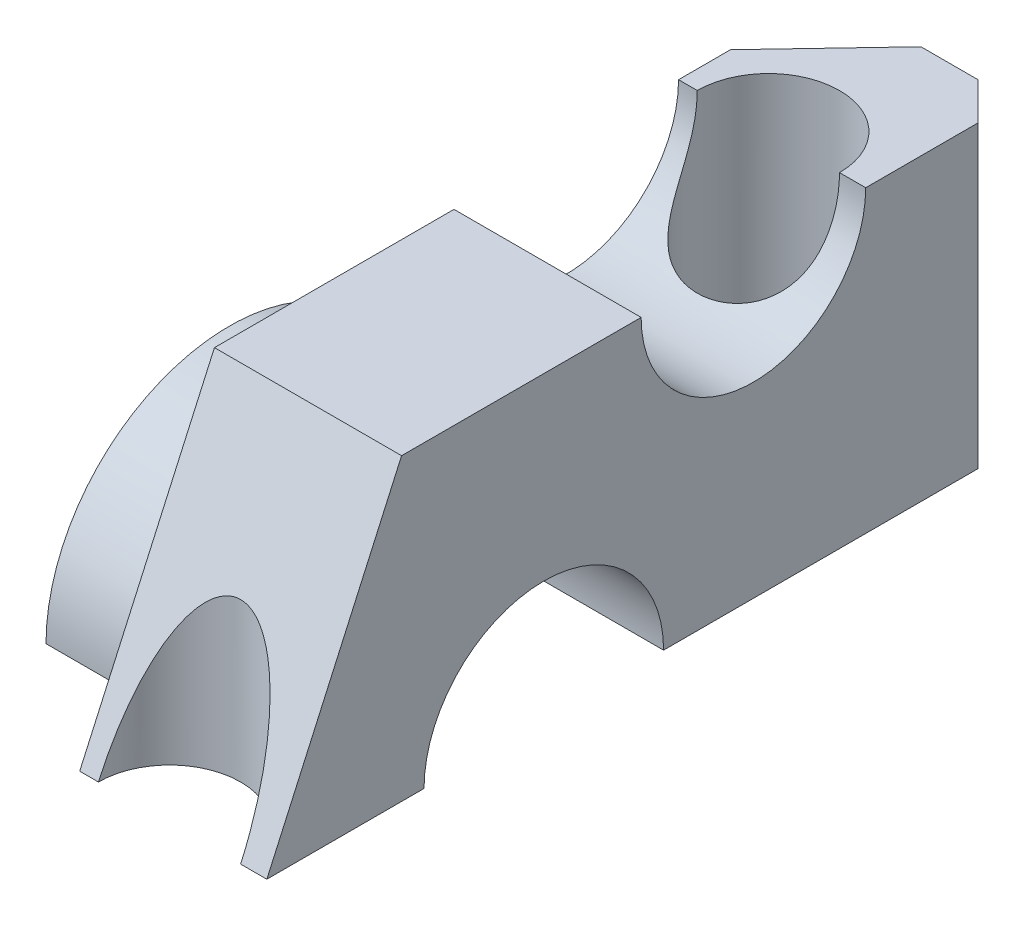
ISO-10303-21;
HEADER;
FILE_DESCRIPTION(('STEP AP214'),'2;1');
FILE_NAME('part.step','',(''),(''),'','','');
FILE_SCHEMA(('AUTOMOTIVE_DESIGN { 1 0 10303 214 1 1 1 1 }'));
ENDSEC;
DATA;
#1=APPLICATION_CONTEXT('core data for automotive mechanical design processes');
#2=APPLICATION_PROTOCOL_DEFINITION('international standard','automotive_design',2000,#1);
#3=PRODUCT_CONTEXT('',#1,'mechanical');
#4=PRODUCT('Part','Part','',(#3));
#5=PRODUCT_RELATED_PRODUCT_CATEGORY('part','',(#4));
#6=PRODUCT_DEFINITION_FORMATION('','',#4);
#7=PRODUCT_DEFINITION_CONTEXT('part definition',#1,'design');
#8=PRODUCT_DEFINITION('design','',#6,#7);
#9=PRODUCT_DEFINITION_SHAPE('','',#8);
#10=(LENGTH_UNIT() NAMED_UNIT(*) SI_UNIT(.MILLI.,.METRE.));
#11=(NAMED_UNIT(*) PLANE_ANGLE_UNIT() SI_UNIT($,.RADIAN.));
#12=(NAMED_UNIT(*) SI_UNIT($,.STERADIAN.) SOLID_ANGLE_UNIT());
#13=UNCERTAINTY_MEASURE_WITH_UNIT(LENGTH_MEASURE(1.E-05),#10,'distance_accuracy_value','');
#14=(GEOMETRIC_REPRESENTATION_CONTEXT(3) GLOBAL_UNCERTAINTY_ASSIGNED_CONTEXT((#13)) GLOBAL_UNIT_ASSIGNED_CONTEXT((#10,
#11,#12)) REPRESENTATION_CONTEXT('',''));
#15=CARTESIAN_POINT('',(0.,0.,0.));
#16=DIRECTION('',(0.,0.,1.));
#17=DIRECTION('',(1.,0.,0.));
#18=AXIS2_PLACEMENT_3D('',#15,#16,#17);
#19=CARTESIAN_POINT('',(25.,40.,0.));
#20=DIRECTION('',(0.,-1.,0.));
#21=DIRECTION('',(0.,0.,-1.));
#22=AXIS2_PLACEMENT_3D('',#19,#20,#21);
#23=PLANE('',#22);
#24=DIRECTION('',(0.,0.,1.));
#25=VECTOR('',#24,1.);
#26=CARTESIAN_POINT('',(0.,40.,0.));
#27=LINE('',#26,#25);
#28=CARTESIAN_POINT('',(0.,40.,5.00000000000003));
#29=VERTEX_POINT('',#28);
#30=CARTESIAN_POINT('',(0.,40.,20.));
#31=VERTEX_POINT('',#30);
#32=EDGE_CURVE('E153',#29,#31,#27,.T.);
#33=ORIENTED_EDGE('',*,*,#32,.F.);
#34=DIRECTION('',(-0.707106781186547,0.,-0.707106781186549));
#35=VECTOR('',#34,1.);
#36=CARTESIAN_POINT('',(0.,40.,5.00000000000003));
#37=LINE('',#36,#35);
#38=CARTESIAN_POINT('',(-5.00000000000002,40.,0.));
#39=VERTEX_POINT('',#38);
#40=EDGE_CURVE('E166',#29,#39,#37,.T.);
#41=ORIENTED_EDGE('',*,*,#40,.T.);
#42=DIRECTION('',(1.,0.,0.));
#43=VECTOR('',#42,1.);
#44=CARTESIAN_POINT('',(-25.,40.,0.));
#45=LINE('',#44,#43);
#46=CARTESIAN_POINT('',(-12.62,40.,0.));
#47=VERTEX_POINT('',#46);
#48=EDGE_CURVE('E283',#47,#39,#45,.T.);
#49=ORIENTED_EDGE('',*,*,#48,.F.);
#50=DIRECTION('',(-0.687777777777778,0.,0.725921296281533));
#51=VECTOR('',#50,1.);
#52=CARTESIAN_POINT('',(5.17569977777779,40.,-18.7826328042477));
#53=LINE('',#52,#51);
#54=CARTESIAN_POINT('',(-25.,40.,13.0665833330676));
#55=VERTEX_POINT('',#54);
#56=EDGE_CURVE('E294',#47,#55,#53,.T.);
#57=ORIENTED_EDGE('',*,*,#56,.T.);
#58=DIRECTION('',(0.,0.,1.));
#59=VECTOR('',#58,1.);
#60=CARTESIAN_POINT('',(-25.,40.,0.));
#61=LINE('',#60,#59);
#62=CARTESIAN_POINT('',(-25.,40.,20.));
#63=VERTEX_POINT('',#62);
#64=EDGE_CURVE('E281',#55,#63,#61,.T.);
#65=ORIENTED_EDGE('',*,*,#64,.T.);
#66=DIRECTION('',(1.,0.,0.));
#67=VECTOR('',#66,1.);
#68=CARTESIAN_POINT('',(-119.,40.,20.));
#69=LINE('',#68,#67);
#70=CARTESIAN_POINT('',(-22.5,40.,20.));
#71=VERTEX_POINT('',#70);
#72=EDGE_CURVE('E268',#63,#71,#69,.T.);
#73=ORIENTED_EDGE('',*,*,#72,.T.);
#74=CARTESIAN_POINT('',(-13.,40.,20.));
#75=DIRECTION('',(0.,-1.,0.));
#76=DIRECTION('',(0.,0.,-1.));
#77=AXIS2_PLACEMENT_3D('',#74,#75,#76);
#78=CIRCLE('',#77,9.5);
#79=CARTESIAN_POINT('',(-3.5,40.,20.));
#80=VERTEX_POINT('',#79);
#81=EDGE_CURVE('E267',#71,#80,#78,.T.);
#82=ORIENTED_EDGE('',*,*,#81,.T.);
#83=DIRECTION('',(-1.,0.,0.));
#84=VECTOR('',#83,1.);
#85=CARTESIAN_POINT('',(119.,40.,20.));
#86=LINE('',#85,#84);
#87=EDGE_CURVE('E168',#31,#80,#86,.T.);
#88=ORIENTED_EDGE('',*,*,#87,.F.);
#89=EDGE_LOOP('',(#33,#41,#49,#57,#65,#73,#82,#88));
#90=FACE_BOUND('',#89,.T.);
#91=ADVANCED_FACE('F35',(#90),#23,.F.);
#92=CARTESIAN_POINT('',(25.,0.,0.));
#93=DIRECTION('',(0.,1.,0.));
#94=DIRECTION('',(0.,0.,1.));
#95=AXIS2_PLACEMENT_3D('',#92,#93,#94);
#96=PLANE('',#95);
#97=DIRECTION('',(0.,0.,-1.));
#98=VECTOR('',#97,1.);
#99=CARTESIAN_POINT('',(0.,0.,0.));
#100=LINE('',#99,#98);
#101=CARTESIAN_POINT('',(0.,0.,100.));
#102=VERTEX_POINT('',#101);
#103=CARTESIAN_POINT('',(0.,0.,79.));
#104=VERTEX_POINT('',#103);
#105=EDGE_CURVE('E232',#102,#104,#100,.T.);
#106=ORIENTED_EDGE('',*,*,#105,.F.);
#107=DIRECTION('',(-1.,0.,0.));
#108=VECTOR('',#107,1.);
#109=CARTESIAN_POINT('',(25.,0.,100.));
#110=LINE('',#109,#108);
#111=CARTESIAN_POINT('',(-3.5,0.,100.));
#112=VERTEX_POINT('',#111);
#113=EDGE_CURVE('E252',#102,#112,#110,.T.);
#114=ORIENTED_EDGE('',*,*,#113,.T.);
#115=CARTESIAN_POINT('',(-13.,0.,100.));
#116=DIRECTION('',(0.,1.,0.));
#117=DIRECTION('',(0.,0.,1.));
#118=AXIS2_PLACEMENT_3D('',#115,#116,#117);
#119=CIRCLE('',#118,9.5);
#120=CARTESIAN_POINT('',(-22.5,0.,100.));
#121=VERTEX_POINT('',#120);
#122=EDGE_CURVE('E261',#112,#121,#119,.T.);
#123=ORIENTED_EDGE('',*,*,#122,.T.);
#124=CARTESIAN_POINT('',(-25.,0.,100.));
#125=VERTEX_POINT('',#124);
#126=EDGE_CURVE('E251',#121,#125,#110,.T.);
#127=ORIENTED_EDGE('',*,*,#126,.T.);
#128=DIRECTION('',(0.,0.,-1.));
#129=VECTOR('',#128,1.);
#130=CARTESIAN_POINT('',(-25.,0.,0.));
#131=LINE('',#130,#129);
#132=CARTESIAN_POINT('',(-25.,0.,87.5));
#133=VERTEX_POINT('',#132);
#134=EDGE_CURVE('E274',#125,#133,#131,.T.);
#135=ORIENTED_EDGE('',*,*,#134,.T.);
#136=DIRECTION('',(1.,0.,0.));
#137=VECTOR('',#136,1.);
#138=CARTESIAN_POINT('',(-42.,0.,87.5));
#139=LINE('',#138,#137);
#140=CARTESIAN_POINT('',(-42.,0.,87.5));
#141=VERTEX_POINT('',#140);
#142=EDGE_CURVE('E321',#141,#133,#139,.T.);
#143=ORIENTED_EDGE('',*,*,#142,.F.);
#144=DIRECTION('',(0.,0.,-1.));
#145=VECTOR('',#144,1.);
#146=CARTESIAN_POINT('',(-42.,0.,87.5));
#147=LINE('',#146,#145);
#148=CARTESIAN_POINT('',(-42.,0.,83.));
#149=VERTEX_POINT('',#148);
#150=EDGE_CURVE('E319',#141,#149,#147,.T.);
#151=ORIENTED_EDGE('',*,*,#150,.T.);
#152=DIRECTION('',(1.,0.,0.));
#153=VECTOR('',#152,1.);
#154=CARTESIAN_POINT('',(-42.,0.,83.));
#155=LINE('',#154,#153);
#156=CARTESIAN_POINT('',(-25.,0.,83.));
#157=VERTEX_POINT('',#156);
#158=EDGE_CURVE('E325',#149,#157,#155,.T.);
#159=ORIENTED_EDGE('',*,*,#158,.T.);
#160=CARTESIAN_POINT('',(-25.,0.,79.));
#161=VERTEX_POINT('',#160);
#162=EDGE_CURVE('E277',#157,#161,#131,.T.);
#163=ORIENTED_EDGE('',*,*,#162,.T.);
#164=DIRECTION('',(-1.,0.,0.));
#165=VECTOR('',#164,1.);
#166=CARTESIAN_POINT('',(119.,0.,79.));
#167=LINE('',#166,#165);
#168=EDGE_CURVE('E241',#104,#161,#167,.T.);
#169=ORIENTED_EDGE('',*,*,#168,.F.);
#170=EDGE_LOOP('',(#106,#114,#123,#127,#135,#143,#151,#159,#163,#169));
#171=FACE_BOUND('',#170,.T.);
#172=ADVANCED_FACE('F208',(#171),#96,.F.);
#173=DIRECTION('',(0.,0.,1.));
#174=VECTOR('',#173,1.);
#175=CARTESIAN_POINT('',(0.,40.,0.));
#176=LINE('',#175,#174);
#177=CARTESIAN_POINT('',(0.,40.,50.));
#178=VERTEX_POINT('',#177);
#179=CARTESIAN_POINT('',(0.,40.,82.));
#180=VERTEX_POINT('',#179);
#181=EDGE_CURVE('E226',#178,#180,#176,.T.);
#182=ORIENTED_EDGE('',*,*,#181,.F.);
#183=DIRECTION('',(-1.,0.,0.));
#184=VECTOR('',#183,1.);
#185=CARTESIAN_POINT('',(119.,40.,50.));
#186=LINE('',#185,#184);
#187=CARTESIAN_POINT('',(-25.,40.,50.));
#188=VERTEX_POINT('',#187);
#189=EDGE_CURVE('E229',#188,#178,#186,.F.);
#190=ORIENTED_EDGE('',*,*,#189,.F.);
#191=CARTESIAN_POINT('',(-25.,40.,82.));
#192=VERTEX_POINT('',#191);
#193=EDGE_CURVE('E280',#188,#192,#61,.T.);
#194=ORIENTED_EDGE('',*,*,#193,.T.);
#195=DIRECTION('',(-1.,0.,0.));
#196=VECTOR('',#195,1.);
#197=CARTESIAN_POINT('',(25.,40.,82.));
#198=LINE('',#197,#196);
#199=EDGE_CURVE('E161',#180,#192,#198,.T.);
#200=ORIENTED_EDGE('',*,*,#199,.F.);
#201=EDGE_LOOP('',(#182,#190,#194,#200));
#202=FACE_BOUND('',#201,.T.);
#203=ADVANCED_FACE('F209',(#202),#23,.F.);
#204=CARTESIAN_POINT('',(-13.,0.,20.));
#205=DIRECTION('',(0.,1.,0.));
#206=DIRECTION('',(0.,0.,1.));
#207=AXIS2_PLACEMENT_3D('',#204,#205,#206);
#208=CIRCLE('',#207,9.5);
#209=CARTESIAN_POINT('',(-13.,0.,29.5));
#210=VERTEX_POINT('',#209);
#211=EDGE_CURVE('E186',#210,#210,#208,.T.);
#212=ORIENTED_EDGE('',*,*,#211,.T.);
#213=EDGE_LOOP('',(#212));
#214=FACE_BOUND('',#213,.T.);
#215=DIRECTION('',(0.,0.,-1.));
#216=VECTOR('',#215,1.);
#217=CARTESIAN_POINT('',(0.,0.,0.));
#218=LINE('',#217,#216);
#219=CARTESIAN_POINT('',(0.,0.,47.));
#220=VERTEX_POINT('',#219);
#221=CARTESIAN_POINT('',(0.,0.,5.00000000000002));
#222=VERTEX_POINT('',#221);
#223=EDGE_CURVE('E156',#220,#222,#218,.T.);
#224=ORIENTED_EDGE('',*,*,#223,.F.);
#225=DIRECTION('',(-1.,0.,0.));
#226=VECTOR('',#225,1.);
#227=CARTESIAN_POINT('',(119.,0.,47.));
#228=LINE('',#227,#226);
#229=CARTESIAN_POINT('',(-25.,0.,47.));
#230=VERTEX_POINT('',#229);
#231=EDGE_CURVE('E243',#230,#220,#228,.F.);
#232=ORIENTED_EDGE('',*,*,#231,.F.);
#233=CARTESIAN_POINT('',(-25.,0.,43.));
#234=VERTEX_POINT('',#233);
#235=EDGE_CURVE('E278',#230,#234,#131,.T.);
#236=ORIENTED_EDGE('',*,*,#235,.T.);
#237=DIRECTION('',(1.,0.,0.));
#238=VECTOR('',#237,1.);
#239=CARTESIAN_POINT('',(-42.,0.,43.));
#240=LINE('',#239,#238);
#241=CARTESIAN_POINT('',(-42.,0.,43.));
#242=VERTEX_POINT('',#241);
#243=EDGE_CURVE('E51',#242,#234,#240,.T.);
#244=ORIENTED_EDGE('',*,*,#243,.F.);
#245=DIRECTION('',(0.,0.,-1.));
#246=VECTOR('',#245,1.);
#247=CARTESIAN_POINT('',(-42.,0.,43.));
#248=LINE('',#247,#246);
#249=CARTESIAN_POINT('',(-42.,0.,38.5));
#250=VERTEX_POINT('',#249);
#251=EDGE_CURVE('E314',#242,#250,#248,.T.);
#252=ORIENTED_EDGE('',*,*,#251,.T.);
#253=DIRECTION('',(1.,0.,0.));
#254=VECTOR('',#253,1.);
#255=CARTESIAN_POINT('',(-42.,0.,38.5));
#256=LINE('',#255,#254);
#257=CARTESIAN_POINT('',(-25.,0.,38.5));
#258=VERTEX_POINT('',#257);
#259=EDGE_CURVE('E291',#250,#258,#256,.T.);
#260=ORIENTED_EDGE('',*,*,#259,.T.);
#261=CARTESIAN_POINT('',(-25.,0.,13.0665833330676));
#262=VERTEX_POINT('',#261);
#263=EDGE_CURVE('E273',#258,#262,#131,.T.);
#264=ORIENTED_EDGE('',*,*,#263,.T.);
#265=DIRECTION('',(0.687777777777778,0.,-0.725921296281533));
#266=VECTOR('',#265,1.);
#267=CARTESIAN_POINT('',(5.17569977777779,0.,-18.7826328042477));
#268=LINE('',#267,#266);
#269=CARTESIAN_POINT('',(-12.62,0.,0.));
#270=VERTEX_POINT('',#269);
#271=EDGE_CURVE('E287',#262,#270,#268,.T.);
#272=ORIENTED_EDGE('',*,*,#271,.T.);
#273=DIRECTION('',(1.,0.,0.));
#274=VECTOR('',#273,1.);
#275=CARTESIAN_POINT('',(-25.,0.,0.));
#276=LINE('',#275,#274);
#277=CARTESIAN_POINT('',(-5.00000000000002,0.,0.));
#278=VERTEX_POINT('',#277);
#279=EDGE_CURVE('E245',#270,#278,#276,.T.);
#280=ORIENTED_EDGE('',*,*,#279,.T.);
#281=DIRECTION('',(0.707106781186547,0.,0.707106781186549));
#282=VECTOR('',#281,1.);
#283=CARTESIAN_POINT('',(0.,0.,5.00000000000003));
#284=LINE('',#283,#282);
#285=EDGE_CURVE('E11',#278,#222,#284,.T.);
#286=ORIENTED_EDGE('',*,*,#285,.T.);
#287=EDGE_LOOP('',(#224,#232,#236,#244,#252,#260,#264,#272,#280,#286));
#288=FACE_BOUND('',#287,.T.);
#289=ADVANCED_FACE('F215',(#214,#288),#96,.F.);
#290=CARTESIAN_POINT('',(25.,0.,100.));
#291=DIRECTION('',(0.,-0.410364677328798,-0.911921505175106));
#292=DIRECTION('',(0.,0.911921505175107,-0.410364677328798));
#293=AXIS2_PLACEMENT_3D('',#290,#291,#292);
#294=PLANE('',#293);
#295=DIRECTION('',(0.,-0.911921505175107,0.410364677328798));
#296=VECTOR('',#295,1.);
#297=CARTESIAN_POINT('',(0.,0.,100.));
#298=LINE('',#297,#296);
#299=EDGE_CURVE('E304',#180,#102,#298,.T.);
#300=ORIENTED_EDGE('',*,*,#299,.F.);
#301=ORIENTED_EDGE('',*,*,#199,.T.);
#302=DIRECTION('',(0.,-0.911921505175107,0.410364677328798));
#303=VECTOR('',#302,1.);
#304=CARTESIAN_POINT('',(-25.,0.,100.));
#305=LINE('',#304,#303);
#306=EDGE_CURVE('E276',#192,#125,#305,.T.);
#307=ORIENTED_EDGE('',*,*,#306,.T.);
#308=ORIENTED_EDGE('',*,*,#126,.F.);
#309=CARTESIAN_POINT('',(-13.,0.,100.));
#310=DIRECTION('',(0.,-0.410364677328798,-0.911921505175106));
#311=DIRECTION('',(0.,-0.911921505175107,0.410364677328798));
#312=AXIS2_PLACEMENT_3D('',#309,#310,#311);
#313=ELLIPSE('',#312,23.1501406549869,9.5);
#314=EDGE_CURVE('E160',#121,#112,#313,.T.);
#315=ORIENTED_EDGE('',*,*,#314,.T.);
#316=ORIENTED_EDGE('',*,*,#113,.F.);
#317=EDGE_LOOP('',(#300,#301,#307,#308,#315,#316));
#318=FACE_BOUND('',#317,.T.);
#319=ADVANCED_FACE('F222',(#318),#294,.F.);
#320=CARTESIAN_POINT('',(119.,40.,35.));
#321=DIRECTION('',(-1.,0.,0.));
#322=DIRECTION('',(0.,0.,1.));
#323=AXIS2_PLACEMENT_3D('',#320,#321,#322);
#324=CYLINDRICAL_SURFACE('',#323,15.);
#325=ORIENTED_EDGE('',*,*,#189,.T.);
#326=CARTESIAN_POINT('',(0.,40.,35.));
#327=DIRECTION('',(1.,0.,0.));
#328=DIRECTION('',(0.,0.,-1.));
#329=AXIS2_PLACEMENT_3D('',#326,#327,#328);
#330=CIRCLE('',#329,15.);
#331=EDGE_CURVE('E233',#178,#31,#330,.T.);
#332=ORIENTED_EDGE('',*,*,#331,.T.);
#333=ORIENTED_EDGE('',*,*,#87,.T.);
#334=CARTESIAN_POINT('',(-22.5,40.,20.));
#335=CARTESIAN_POINT('',(-22.5000034184629,39.5976081351351,20.0000014306751));
#336=CARTESIAN_POINT('',(-22.5000423847704,39.1951838802314,20.0162026022673));
#337=CARTESIAN_POINT('',(-22.4997094369382,38.3929120425052,20.0809092641443));
#338=CARTESIAN_POINT('',(-22.4993374755136,37.9930647615376,20.1294184718204));
#339=CARTESIAN_POINT('',(-22.4967013062414,37.1978907866451,20.2585385072372));
#340=CARTESIAN_POINT('',(-22.4944339028776,36.8025728704237,20.3392034259084));
#341=CARTESIAN_POINT('',(-22.485577571859,36.0197631121668,20.5320969935554));
#342=CARTESIAN_POINT('',(-22.4789886775111,35.6322712098379,20.6443253992588));
#343=CARTESIAN_POINT('',(-22.45769004559,34.8496918748651,20.9055896785274));
#344=CARTESIAN_POINT('',(-22.4426118065267,34.4551087266664,21.0561124065836));
#345=CARTESIAN_POINT('',(-22.3993176069557,33.6805185669058,21.3896381884355));
#346=CARTESIAN_POINT('',(-22.3710991599717,33.3005143287975,21.5726473854762));
#347=CARTESIAN_POINT('',(-22.2959524762372,32.5594709116746,21.9687059460642));
#348=CARTESIAN_POINT('',(-22.249066599514,32.1983908750091,22.1816865958926));
#349=CARTESIAN_POINT('',(-22.1302618267247,31.4982423199812,22.6349809960852));
#350=CARTESIAN_POINT('',(-22.0583581389024,31.15916057717,22.875278081265));
#351=CARTESIAN_POINT('',(-21.9130946627245,30.6193878786666,23.2920006880014));
#352=CARTESIAN_POINT('',(-21.8487485640725,30.4112235175008,23.4619542696375));
#353=CARTESIAN_POINT('',(-21.704602247149,30.0073713878733,23.8099007429439));
#354=CARTESIAN_POINT('',(-21.624806587489,29.8116799616797,23.9878912513554));
#355=CARTESIAN_POINT('',(-21.4481313705514,29.4340821897194,24.3496617182247));
#356=CARTESIAN_POINT('',(-21.3512639908844,29.252166149053,24.5334374737009));
#357=CARTESIAN_POINT('',(-21.1390014104208,28.903065078009,24.904313688746));
#358=CARTESIAN_POINT('',(-21.0236057506927,28.7358804126754,25.0914142305651));
#359=CARTESIAN_POINT('',(-20.7723335043561,28.4159285155438,25.4673880600129));
#360=CARTESIAN_POINT('',(-20.6363054688875,28.2632827443926,25.6562638695778));
#361=CARTESIAN_POINT('',(-20.3439698044314,27.974510561991,26.030966458519));
#362=CARTESIAN_POINT('',(-20.187661996176,27.838384296789,26.2167932109261));
#363=CARTESIAN_POINT('',(-19.8549583166487,27.5829111931692,26.5818322915887));
#364=CARTESIAN_POINT('',(-19.6785657670519,27.4635615874511,26.7610457071053));
#365=CARTESIAN_POINT('',(-19.3064632694255,27.2414350414568,27.10939123377));
#366=CARTESIAN_POINT('',(-19.1107553512173,27.1386563627513,27.2785244012457));
#367=CARTESIAN_POINT('',(-18.7257418686685,26.9603581004133,27.5841230889515));
#368=CARTESIAN_POINT('',(-18.5384424824826,26.8830503682432,27.7220815982229));
#369=CARTESIAN_POINT('',(-18.151119250311,26.7402276507387,27.9856639422131));
#370=CARTESIAN_POINT('',(-17.9510965084636,26.6747116439978,28.1112888448478));
#371=CARTESIAN_POINT('',(-17.539726919095,26.5547379171471,28.3484885129188));
#372=CARTESIAN_POINT('',(-17.3283798378682,26.500280425368,28.4600629882307));
#373=CARTESIAN_POINT('',(-16.895905674607,26.4016354584263,28.6677251879854));
#374=CARTESIAN_POINT('',(-16.6747784333909,26.3574481504941,28.7638126602439));
#375=CARTESIAN_POINT('',(-16.2290599895697,26.2793888456357,28.93751610104));
#376=CARTESIAN_POINT('',(-16.0046360756814,26.2453216956357,29.0154742134629));
#377=CARTESIAN_POINT('',(-15.5495518340804,26.1856292624365,29.1545834821815));
#378=CARTESIAN_POINT('',(-15.3188916474448,26.1600037884419,29.2157350183274));
#379=CARTESIAN_POINT('',(-14.8529041731652,26.1166372003223,29.320610889957));
#380=CARTESIAN_POINT('',(-14.617576618593,26.0988965384982,29.3643342256824));
#381=CARTESIAN_POINT('',(-14.1438541054141,26.0708865364836,29.4339236818124));
#382=CARTESIAN_POINT('',(-13.9054590712372,26.0606173807209,29.4597893614153));
#383=CARTESIAN_POINT('',(-13.4208380527055,26.0471215636063,29.4938640155479));
#384=CARTESIAN_POINT('',(-13.1745722598706,26.0440892103261,29.5015857433181));
#385=CARTESIAN_POINT('',(-12.6822049668365,26.0455520723358,29.4978744394683));
#386=CARTESIAN_POINT('',(-12.4361034694364,26.050047412759,29.4864410894322));
#387=CARTESIAN_POINT('',(-11.9457570285666,26.0666856596118,29.4445288950559));
#388=CARTESIAN_POINT('',(-11.7015123056871,26.0788294607632,29.4140478225044));
#389=CARTESIAN_POINT('',(-11.2166315533147,26.111077164819,29.3343431144855));
#390=CARTESIAN_POINT('',(-10.9759955201024,26.1311810595184,29.2851194983377));
#391=CARTESIAN_POINT('',(-10.4982561989374,26.1800207992599,29.1679996378307));
#392=CARTESIAN_POINT('',(-10.2611932500274,26.2088206113867,29.0999653462226));
#393=CARTESIAN_POINT('',(-9.79423020659,26.2756480789426,28.9461425366382));
#394=CARTESIAN_POINT('',(-9.56433015739303,26.3136757927572,28.8603539063298));
#395=CARTESIAN_POINT('',(-9.11347851603066,26.3997106301964,28.6720593383526));
#396=CARTESIAN_POINT('',(-8.89252472024858,26.447715278242,28.5695575490809));
#397=CARTESIAN_POINT('',(-8.46118032013064,26.5545264538278,28.3491180335866));
#398=CARTESIAN_POINT('',(-8.25078944248753,26.6133327017016,28.2311807070316));
#399=CARTESIAN_POINT('',(-7.84627256472597,26.7412444417089,27.9839925120198));
#400=CARTESIAN_POINT('',(-7.65190356414492,26.8101174070632,27.8550189177528));
#401=CARTESIAN_POINT('',(-7.27612729416905,26.9596847570516,27.585560712747));
#402=CARTESIAN_POINT('',(-7.09471976227213,27.0403789021765,27.445076335254));
#403=CARTESIAN_POINT('',(-6.74601652710709,27.2140994620679,27.1546601698509));
#404=CARTESIAN_POINT('',(-6.57871681001142,27.3071223496706,27.0047310904146));
#405=CARTESIAN_POINT('',(-6.25899110599365,27.5058529381559,26.6976069252909));
#406=CARTESIAN_POINT('',(-6.10656499685332,27.6115605347909,26.5404118993243));
#407=CARTESIAN_POINT('',(-5.81959921518135,27.8337984620339,26.2238804847155));
#408=CARTESIAN_POINT('',(-5.68479367596538,27.9501075600104,26.0646294278006));
#409=CARTESIAN_POINT('',(-5.4301236381753,28.1949237427873,25.7436013218537));
#410=CARTESIAN_POINT('',(-5.31025888028587,28.3234306158123,25.5818243167175));
#411=CARTESIAN_POINT('',(-5.08523255279539,28.5923044784713,25.2578856603595));
#412=CARTESIAN_POINT('',(-4.98007259707337,28.7326727672095,25.0957239689008));
#413=CARTESIAN_POINT('',(-4.78393279639572,29.0247264705283,24.7730388278929));
#414=CARTESIAN_POINT('',(-4.692953641714,29.1764124354844,24.612515458447));
#415=CARTESIAN_POINT('',(-4.51867328126252,29.5010747922465,24.2841512407644));
#416=CARTESIAN_POINT('',(-4.43630973077858,29.6747973577732,24.1165513549105));
#417=CARTESIAN_POINT('',(-4.28563815048592,30.0334614641141,23.7871765621947));
#418=CARTESIAN_POINT('',(-4.21733042779061,30.2184032499488,23.6254017826723));
#419=CARTESIAN_POINT('',(-4.09334893825969,30.5986653764595,23.3091447438824));
#420=CARTESIAN_POINT('',(-4.03768326416637,30.7939922669414,23.1546672057298));
#421=CARTESIAN_POINT('',(-3.93756914112281,31.1939704055786,22.8543655079626));
#422=CARTESIAN_POINT('',(-3.89312297977393,31.3986235452827,22.7085431177169));
#423=CARTESIAN_POINT('',(-3.79486201172747,31.9171512395665,22.3585201205838));
#424=CARTESIAN_POINT('',(-3.74687818326838,32.2360700484875,22.1601102272269));
#425=CARTESIAN_POINT('',(-3.66763898773067,32.8895251719108,21.7870188644902));
#426=CARTESIAN_POINT('',(-3.63639000357212,33.2240673925991,21.6123464678753));
#427=CARTESIAN_POINT('',(-3.58631710667728,33.9065669960079,21.2882175785091));
#428=CARTESIAN_POINT('',(-3.5675098262257,34.25454168085,21.1387950379597));
#429=CARTESIAN_POINT('',(-3.5386208193561,34.9610542489149,20.8666228282408));
#430=CARTESIAN_POINT('',(-3.528538307004,35.319591177673,20.7438707573203));
#431=CARTESIAN_POINT('',(-3.51382928568085,36.0502184627902,20.5242681159419));
#432=CARTESIAN_POINT('',(-3.50928299250131,36.4224293922378,20.427813720406));
#433=CARTESIAN_POINT('',(-3.50330740652898,37.1731774021342,20.2637617626078));
#434=CARTESIAN_POINT('',(-3.50187814345767,37.55171454287,20.1961644755084));
#435=CARTESIAN_POINT('',(-3.50028093002426,38.3126415809608,20.0902620304433));
#436=CARTESIAN_POINT('',(-3.50011224044729,38.6950290886463,20.0519397171344));
#437=CARTESIAN_POINT('',(-3.49997231912769,39.4616254997544,20.0047458755575));
#438=CARTESIAN_POINT('',(-3.50000109592263,39.8458344812119,19.9958756206911));
#439=CARTESIAN_POINT('',(-3.49999914235665,40.6501044131726,20.0082020605646));
#440=CARTESIAN_POINT('',(-3.49996253403942,41.0701236810288,20.0323180962462));
#441=CARTESIAN_POINT('',(-3.50061432013645,41.906678045094,20.1157363811094));
#442=CARTESIAN_POINT('',(-3.50130277350909,42.3232128551883,20.1750414915193));
#443=CARTESIAN_POINT('',(-3.50537172780721,43.150436550989,20.3285322412781));
#444=CARTESIAN_POINT('',(-3.50875619941106,43.5611159040356,20.4227692185215));
#445=CARTESIAN_POINT('',(-3.52129471685324,44.3730142503577,20.6454216660089));
#446=CARTESIAN_POINT('',(-3.53044857755933,44.7742335467657,20.7738360394679));
#447=CARTESIAN_POINT('',(-3.55865837715719,45.5650083364172,21.0641313993261));
#448=CARTESIAN_POINT('',(-3.57773499452104,45.9545376684824,21.2260818471828));
#449=CARTESIAN_POINT('',(-3.63089232177325,46.7178652938887,21.5818199781019));
#450=CARTESIAN_POINT('',(-3.66497548272186,47.0916610064826,21.7756128588345));
#451=CARTESIAN_POINT('',(-3.75394137381167,47.8188719080574,22.1921761417202));
#452=CARTESIAN_POINT('',(-3.80876767330658,48.1723394199076,22.4148668584151));
#453=CARTESIAN_POINT('',(-3.94570616262506,48.855878652764,22.8861495655422));
#454=CARTESIAN_POINT('',(-4.02780027363257,49.1859656997798,23.1347243198492));
#455=CARTESIAN_POINT('',(-4.1904194235817,49.7053321389645,23.5599110552984));
#456=CARTESIAN_POINT('',(-4.26100371393137,49.9027471572441,23.7304626343637));
#457=CARTESIAN_POINT('',(-4.41779783990539,50.2850468005509,24.0782558530765));
#458=CARTESIAN_POINT('',(-4.50400297488809,50.4699351721773,24.255495467484));
#459=CARTESIAN_POINT('',(-4.69344897651107,50.8260056311858,24.6143624291474));
#460=CARTESIAN_POINT('',(-4.79667903671402,50.9971963113519,24.7959869311037));
#461=CARTESIAN_POINT('',(-5.02135897754795,51.3250503231115,25.1611264207245));
#462=CARTESIAN_POINT('',(-5.142809376385,51.4817132413148,25.3446414620196));
#463=CARTESIAN_POINT('',(-5.40552688066937,51.7807809220575,25.7118539007782));
#464=CARTESIAN_POINT('',(-5.54692314530264,51.9230814656945,25.8955440497963));
#465=CARTESIAN_POINT('',(-5.84908900723435,52.1917666010139,26.2586132206904));
#466=CARTESIAN_POINT('',(-6.00985877580939,52.3181510519657,26.4379922044354));
#467=CARTESIAN_POINT('',(-6.35037093522726,52.5549358000499,26.7891263958049));
#468=CARTESIAN_POINT('',(-6.53011247244709,52.6653368158175,26.9608819459473));
#469=CARTESIAN_POINT('',(-6.90762555447835,52.8704793749093,27.2935760979493));
#470=CARTESIAN_POINT('',(-7.10539556136669,52.9652222520189,27.4545156204417));
#471=CARTESIAN_POINT('',(-7.49574378632336,53.1304928869924,27.7463629126393));
#472=CARTESIAN_POINT('',(-7.68666269090517,53.2025214976636,27.8786471064267));
#473=CARTESIAN_POINT('',(-8.08050462344941,53.3352410368467,28.1303858196813));
#474=CARTESIAN_POINT('',(-8.28342672481545,53.3959328390127,28.2498413274699));
#475=CARTESIAN_POINT('',(-8.69984928086571,53.5067249046796,28.4743533739364));
#476=CARTESIAN_POINT('',(-8.91334993003909,53.5568249733596,28.5794096477471));
#477=CARTESIAN_POINT('',(-9.3493866961355,53.6472064949599,28.7738250790739));
#478=CARTESIAN_POINT('',(-9.57192299406374,53.687487751073,28.8631839219426));
#479=CARTESIAN_POINT('',(-10.0219679968903,53.7585820431686,29.0242914168435));
#480=CARTESIAN_POINT('',(-10.2493969650545,53.7894927061799,29.0962199613272));
#481=CARTESIAN_POINT('',(-10.7099241580466,53.8430593728419,29.2229382196581));
#482=CARTESIAN_POINT('',(-10.9430222988459,53.8657154987622,29.2777281873671));
#483=CARTESIAN_POINT('',(-11.4133094688699,53.9032843036603,29.3696223433018));
#484=CARTESIAN_POINT('',(-11.6504988122826,53.9181963851663,29.4067251669033));
#485=CARTESIAN_POINT('',(-12.1273528523887,53.940632464018,29.4628815268237));
#486=CARTESIAN_POINT('',(-12.367017604027,53.9481562970141,29.481934661632));
#487=CARTESIAN_POINT('',(-12.8535288507476,53.9561064809056,29.5020715492577));
#488=CARTESIAN_POINT('',(-13.1003986932199,53.9563412977511,29.5026703738162));
#489=CARTESIAN_POINT('',(-13.5933304340571,53.9492338137895,29.4846606629049));
#490=CARTESIAN_POINT('',(-13.839392318486,53.9418913829681,29.4660517978593));
#491=CARTESIAN_POINT('',(-14.3290007582412,53.9194348227834,29.4098076916324));
#492=CARTESIAN_POINT('',(-14.5725470635544,53.9043199283855,29.3721705775283));
#493=CARTESIAN_POINT('',(-15.0553661748357,53.8659354200506,29.2782515499931));
#494=CARTESIAN_POINT('',(-15.2946389958566,53.8426658348433,29.2219697022488));
#495=CARTESIAN_POINT('',(-15.7683339774242,53.7872861410136,29.0910395004763));
#496=CARTESIAN_POINT('',(-16.0027268500422,53.7551335424373,29.0163030602081));
#497=CARTESIAN_POINT('',(-16.4637098496951,53.6813402593151,28.8494517911348));
#498=CARTESIAN_POINT('',(-16.690299945101,53.6396995363136,28.7573368918949));
#499=CARTESIAN_POINT('',(-17.1339051155005,53.5461551207399,28.5568715848545));
#500=CARTESIAN_POINT('',(-17.3509229171515,53.4942543741189,28.4485258395598));
#501=CARTESIAN_POINT('',(-17.7738138534682,53.3793635565913,28.2169828195611));
#502=CARTESIAN_POINT('',(-17.9796872912131,53.3163737874574,28.0937859490389));
#503=CARTESIAN_POINT('',(-18.3743497229994,53.1800554736599,27.8371256795464));
#504=CARTESIAN_POINT('',(-18.5634165601829,53.1069875452178,27.7039509755837));
#505=CARTESIAN_POINT('',(-18.9282194546205,52.9488767428645,27.4268884493654));
#506=CARTESIAN_POINT('',(-19.103955804841,52.8638341322402,27.2830008626863));
#507=CARTESIAN_POINT('',(-19.4410646711608,52.681333570676,26.9866333743262));
#508=CARTESIAN_POINT('',(-19.6024406215704,52.5838786017974,26.8341555413374));
#509=CARTESIAN_POINT('',(-19.9101827909445,52.3762897099687,26.5228279696515));
#510=CARTESIAN_POINT('',(-20.0565490563223,52.2661558262268,26.3639782506598));
#511=CARTESIAN_POINT('',(-20.3320749459859,52.0347569978599,26.0443861498765));
#512=CARTESIAN_POINT('',(-20.4614378469832,51.9136599151061,25.8836971862041));
#513=CARTESIAN_POINT('',(-20.7052262115558,51.6593433314185,25.5606158704026));
#514=CARTESIAN_POINT('',(-20.8196518852148,51.5261240010219,25.3982235422651));
#515=CARTESIAN_POINT('',(-21.0339270056736,51.2479742545613,25.0738362528615));
#516=CARTESIAN_POINT('',(-21.1337747594931,51.1030424813254,24.9118413398929));
#517=CARTESIAN_POINT('',(-21.3195249197641,50.8020709141981,24.5902073690515));
#518=CARTESIAN_POINT('',(-21.4054266096921,50.6460305501597,24.4305684326073));
#519=CARTESIAN_POINT('',(-21.570471828712,50.3107294808548,24.1028405921569));
#520=CARTESIAN_POINT('',(-21.6485356175185,50.1306089373136,23.9350884975171));
#521=CARTESIAN_POINT('',(-21.7907637165637,49.7592302149501,23.6061871732095));
#522=CARTESIAN_POINT('',(-21.8549276107394,49.5679717029544,23.4450381413069));
#523=CARTESIAN_POINT('',(-21.9708756516385,49.1751711117139,23.1307308689744));
#524=CARTESIAN_POINT('',(-22.0226503214734,48.9736213024274,22.977578815233));
#525=CARTESIAN_POINT('',(-22.1152981407004,48.5613450464802,22.680585691902));
#526=CARTESIAN_POINT('',(-22.1561690929888,48.3506167602885,22.5367465032739));
#527=CARTESIAN_POINT('',(-22.2462057110892,47.8160300964657,22.191628525395));
#528=CARTESIAN_POINT('',(-22.2896824517331,47.4871583783469,21.9965830322678));
#529=CARTESIAN_POINT('',(-22.3606939296429,46.8140808615969,21.6315653771066));
#530=CARTESIAN_POINT('',(-22.3882222915648,46.4698689898897,21.461603262326));
#531=CARTESIAN_POINT('',(-22.431682651634,45.7685223884016,21.1482200936326));
#532=CARTESIAN_POINT('',(-22.4476042699711,45.4113763905637,21.0048228817365));
#533=CARTESIAN_POINT('',(-22.4715682570909,44.6869606241359,20.7458658073798));
#534=CARTESIAN_POINT('',(-22.4796120301121,44.3196926718047,20.6303009865219));
#535=CARTESIAN_POINT('',(-22.4901473725451,43.6271895199766,20.4413439954747));
#536=CARTESIAN_POINT('',(-22.4932394927494,43.3029330671368,20.3643725163087));
#537=CARTESIAN_POINT('',(-22.4973928286848,42.6500263567741,20.2321876492143));
#538=CARTESIAN_POINT('',(-22.4984542238478,42.3213764900314,20.1769723392844));
#539=CARTESIAN_POINT('',(-22.4996900539043,41.6613573945357,20.088572379688));
#540=CARTESIAN_POINT('',(-22.4998651026015,41.32999020688,20.055372497966));
#541=CARTESIAN_POINT('',(-22.5000186724125,40.6657561754856,20.0110845045563));
#542=CARTESIAN_POINT('',(-22.4999971719873,40.3328891713831,19.9999988164367));
#543=CARTESIAN_POINT('',(-22.5,40.,20.));
#544=B_SPLINE_CURVE_WITH_KNOTS('',3,(#334,#335,#336,#337,#338,#339,#340,#341,#342,#343,#344,
#345,#346,#347,#348,#349,#350,#351,#352,#353,#354,#355,#356,#357,#358,#359,#360,#361,#362,#363,
#364,#365,#366,#367,#368,#369,#370,#371,#372,#373,#374,#375,#376,#377,#378,#379,#380,#381,#382,
#383,#384,#385,#386,#387,#388,#389,#390,#391,#392,#393,#394,#395,#396,#397,#398,#399,#400,#401,
#402,#403,#404,#405,#406,#407,#408,#409,#410,#411,#412,#413,#414,#415,#416,#417,#418,#419,#420,
#421,#422,#423,#424,#425,#426,#427,#428,#429,#430,#431,#432,#433,#434,#435,#436,#437,#438,#439,
#440,#441,#442,#443,#444,#445,#446,#447,#448,#449,#450,#451,#452,#453,#454,#455,#456,#457,#458,
#459,#460,#461,#462,#463,#464,#465,#466,#467,#468,#469,#470,#471,#472,#473,#474,#475,#476,#477,
#478,#479,#480,#481,#482,#483,#484,#485,#486,#487,#488,#489,#490,#491,#492,#493,#494,#495,#496,
#497,#498,#499,#500,#501,#502,#503,#504,#505,#506,#507,#508,#509,#510,#511,#512,#513,#514,#515,
#516,#517,#518,#519,#520,#521,#522,#523,#524,#525,#526,#527,#528,#529,#530,#531,#532,#533,#534,
#535,#536,#537,#538,#539,#540,#541,#542,#543),.UNSPECIFIED.,.T.,.F.,(4,2,2,2,2,2,2,2,2,2,2,2,2,
2,2,2,2,2,2,2,2,2,2,2,2,2,2,2,2,2,2,2,2,2,2,2,2,2,2,2,2,2,2,2,2,2,2,2,2,2,2,2,2,2,2,2,2,2,2,2,2,
2,2,2,2,2,2,2,2,2,2,2,2,2,2,2,2,2,2,2,2,2,2,2,2,2,2,2,2,2,2,2,2,2,2,2,2,2,2,2,2,2,2,2,4),(0.,
1.20690603034746,2.41395095236879,3.62303493901015,4.83210960701226,6.09823271814409,
7.36459551079979,8.6281009101492,9.89083956688777,10.7190970454276,11.5471105063001,
12.3745357011782,13.2019813939181,14.0358244155577,14.8696748086505,15.7033874968027,
16.537012664512,17.2715062157134,18.0059361139743,18.7403811748408,19.4748381939193,
20.1940434720493,20.9132324938766,21.6324627656163,22.3517107903355,23.0900634845549,
23.8284284525824,24.5668798110577,25.3053304083437,26.0493511501415,26.7933765995198,
27.5372176536201,28.2810394514852,29.0098074899978,29.7385607649528,30.4671059971287,
31.1956452422556,31.9114620555706,32.6272664432897,33.3431493302967,34.0590670532102,
34.8234837013274,35.5879170498261,36.3528383756636,37.1179155393068,38.2522338375582,
39.3869844742031,40.5232490160801,41.6594111916808,42.8118468246988,43.9642934463622,
45.1160642069335,46.2678847652976,47.5285088457223,48.7892354417084,50.0518222683909,
51.3143685823522,52.5795565766112,53.8449512942269,55.1069280384185,56.3680697447332,
57.1781424888785,57.9879718686463,58.7972891801144,59.6066295138046,60.4214743173615,
61.2363263252988,62.0511416850903,62.8658876017831,63.5945482107342,64.3231526433678,
65.0517704765436,65.7804029128484,66.5011603004146,67.221907011399,67.9427093214763,
68.6635276652341,69.4032714112152,70.1430278503227,70.8828571167513,71.6226837767273,
72.3661124037387,73.1095440439241,73.8527625324933,74.5959607985153,75.3226571477285,
76.049337521586,76.7758436390951,77.5023475100224,78.2191714609215,78.9359853290121,
79.6528823768813,80.3698162459741,81.1437304258446,81.9176677679407,82.6921952388477,
83.466878659684,84.6196951906631,85.7729722411624,86.9272793963326,88.0813807569521,
89.0804960776454,90.0795231138678,91.0778582191045,92.0763027291954),.UNSPECIFIED.);
#545=EDGE_CURVE('E178',#71,#80,#544,.T.);
#546=ORIENTED_EDGE('',*,*,#545,.F.);
#547=ORIENTED_EDGE('',*,*,#72,.F.);
#548=CARTESIAN_POINT('',(-25.,40.,35.));
#549=DIRECTION('',(-1.,0.,0.));
#550=DIRECTION('',(0.,0.,1.));
#551=AXIS2_PLACEMENT_3D('',#548,#549,#550);
#552=CIRCLE('',#551,15.);
#553=EDGE_CURVE('E239',#63,#188,#552,.T.);
#554=ORIENTED_EDGE('',*,*,#553,.T.);
#555=EDGE_LOOP('',(#325,#332,#333,#546,#547,#554));
#556=FACE_BOUND('',#555,.T.);
#557=ADVANCED_FACE('F236',(#556),#324,.F.);
#558=CARTESIAN_POINT('',(119.,0.,63.));
#559=DIRECTION('',(-1.,0.,0.));
#560=DIRECTION('',(0.,0.,1.));
#561=AXIS2_PLACEMENT_3D('',#558,#559,#560);
#562=CYLINDRICAL_SURFACE('',#561,16.);
#563=ORIENTED_EDGE('',*,*,#231,.T.);
#564=CARTESIAN_POINT('',(0.,0.,63.));
#565=DIRECTION('',(1.,0.,0.));
#566=DIRECTION('',(0.,0.,-1.));
#567=AXIS2_PLACEMENT_3D('',#564,#565,#566);
#568=CIRCLE('',#567,16.);
#569=EDGE_CURVE('E169',#220,#104,#568,.T.);
#570=ORIENTED_EDGE('',*,*,#569,.T.);
#571=ORIENTED_EDGE('',*,*,#168,.T.);
#572=CARTESIAN_POINT('',(-25.,0.,63.));
#573=DIRECTION('',(-1.,0.,0.));
#574=DIRECTION('',(0.,0.,1.));
#575=AXIS2_PLACEMENT_3D('',#572,#573,#574);
#576=CIRCLE('',#575,16.);
#577=EDGE_CURVE('E173',#161,#230,#576,.T.);
#578=ORIENTED_EDGE('',*,*,#577,.T.);
#579=EDGE_LOOP('',(#563,#570,#571,#578));
#580=FACE_BOUND('',#579,.T.);
#581=ADVANCED_FACE('F344',(#580),#562,.F.);
#582=CARTESIAN_POINT('',(-25.,0.,0.));
#583=DIRECTION('',(-1.,0.,0.));
#584=DIRECTION('',(0.,0.,-1.));
#585=AXIS2_PLACEMENT_3D('',#582,#583,#584);
#586=PLANE('',#585);
#587=ORIENTED_EDGE('',*,*,#263,.F.);
#588=CARTESIAN_POINT('',(-25.,0.,63.));
#589=DIRECTION('',(1.,0.,0.));
#590=DIRECTION('',(0.,0.,-1.));
#591=AXIS2_PLACEMENT_3D('',#588,#589,#590);
#592=CIRCLE('',#591,24.5);
#593=EDGE_CURVE('E305',#258,#133,#592,.T.);
#594=ORIENTED_EDGE('',*,*,#593,.T.);
#595=ORIENTED_EDGE('',*,*,#134,.F.);
#596=ORIENTED_EDGE('',*,*,#306,.F.);
#597=ORIENTED_EDGE('',*,*,#193,.F.);
#598=ORIENTED_EDGE('',*,*,#553,.F.);
#599=ORIENTED_EDGE('',*,*,#64,.F.);
#600=DIRECTION('',(0.,1.,0.));
#601=VECTOR('',#600,1.);
#602=CARTESIAN_POINT('',(-25.,0.,13.0665833330676));
#603=LINE('',#602,#601);
#604=EDGE_CURVE('E171',#262,#55,#603,.T.);
#605=ORIENTED_EDGE('',*,*,#604,.F.);
#606=EDGE_LOOP('',(#587,#594,#595,#596,#597,#598,#599,#605));
#607=FACE_BOUND('',#606,.T.);
#608=ADVANCED_FACE('F301',(#607),#586,.T.);
#609=ORIENTED_EDGE('',*,*,#162,.F.);
#610=CARTESIAN_POINT('',(-25.,0.,63.));
#611=DIRECTION('',(-1.,0.,0.));
#612=DIRECTION('',(0.,0.,-1.));
#613=AXIS2_PLACEMENT_3D('',#610,#611,#612);
#614=CIRCLE('',#613,20.);
#615=EDGE_CURVE('E307',#157,#234,#614,.T.);
#616=ORIENTED_EDGE('',*,*,#615,.T.);
#617=ORIENTED_EDGE('',*,*,#235,.F.);
#618=ORIENTED_EDGE('',*,*,#577,.F.);
#619=EDGE_LOOP('',(#609,#616,#617,#618));
#620=FACE_BOUND('',#619,.T.);
#621=ADVANCED_FACE('F205',(#620),#586,.T.);
#622=CARTESIAN_POINT('',(-25.,0.,0.));
#623=DIRECTION('',(0.,0.,-1.));
#624=DIRECTION('',(-1.,0.,0.));
#625=AXIS2_PLACEMENT_3D('',#622,#623,#624);
#626=PLANE('',#625);
#627=ORIENTED_EDGE('',*,*,#48,.T.);
#628=DIRECTION('',(0.,-1.,0.));
#629=VECTOR('',#628,1.);
#630=CARTESIAN_POINT('',(-5.00000000000002,0.,0.));
#631=LINE('',#630,#629);
#632=EDGE_CURVE('E44',#39,#278,#631,.T.);
#633=ORIENTED_EDGE('',*,*,#632,.T.);
#634=ORIENTED_EDGE('',*,*,#279,.F.);
#635=DIRECTION('',(0.,-1.,0.));
#636=VECTOR('',#635,1.);
#637=CARTESIAN_POINT('',(-12.62,134.,0.));
#638=LINE('',#637,#636);
#639=EDGE_CURVE('E289',#47,#270,#638,.T.);
#640=ORIENTED_EDGE('',*,*,#639,.F.);
#641=EDGE_LOOP('',(#627,#633,#634,#640));
#642=FACE_BOUND('',#641,.T.);
#643=ADVANCED_FACE('F198',(#642),#626,.T.);
#644=CARTESIAN_POINT('',(-13.,94.,100.));
#645=DIRECTION('',(0.,-1.,0.));
#646=DIRECTION('',(0.,0.,-1.));
#647=AXIS2_PLACEMENT_3D('',#644,#645,#646);
#648=CYLINDRICAL_SURFACE('',#647,9.5);
#649=ORIENTED_EDGE('',*,*,#314,.F.);
#650=ORIENTED_EDGE('',*,*,#122,.F.);
#651=EDGE_LOOP('',(#649,#650));
#652=FACE_BOUND('',#651,.T.);
#653=ADVANCED_FACE('F196',(#652),#648,.F.);
#654=CARTESIAN_POINT('',(-13.,94.,20.));
#655=DIRECTION('',(0.,-1.,0.));
#656=DIRECTION('',(0.,0.,-1.));
#657=AXIS2_PLACEMENT_3D('',#654,#655,#656);
#658=CYLINDRICAL_SURFACE('',#657,9.5);
#659=ORIENTED_EDGE('',*,*,#211,.F.);
#660=EDGE_LOOP('',(#659));
#661=FACE_BOUND('',#660,.T.);
#662=ORIENTED_EDGE('',*,*,#81,.F.);
#663=ORIENTED_EDGE('',*,*,#545,.T.);
#664=EDGE_LOOP('',(#662,#663));
#665=FACE_BOUND('',#664,.T.);
#666=ADVANCED_FACE('F188',(#661,#665),#658,.F.);
#667=CARTESIAN_POINT('',(-12.62,134.,0.));
#668=DIRECTION('',(0.725921296281533,0.,0.687777777777778));
#669=DIRECTION('',(0.687777777777778,0.,-0.725921296281533));
#670=AXIS2_PLACEMENT_3D('',#667,#668,#669);
#671=PLANE('',#670);
#672=ORIENTED_EDGE('',*,*,#639,.T.);
#673=ORIENTED_EDGE('',*,*,#271,.F.);
#674=ORIENTED_EDGE('',*,*,#604,.T.);
#675=ORIENTED_EDGE('',*,*,#56,.F.);
#676=EDGE_LOOP('',(#672,#673,#674,#675));
#677=FACE_BOUND('',#676,.T.);
#678=ADVANCED_FACE('F194',(#677),#671,.F.);
#679=CARTESIAN_POINT('',(0.,0.,5.00000000000003));
#680=DIRECTION('',(0.707106781186548,0.,-0.707106781186546));
#681=DIRECTION('',(0.,-1.,0.));
#682=AXIS2_PLACEMENT_3D('',#679,#680,#681);
#683=PLANE('',#682);
#684=ORIENTED_EDGE('',*,*,#285,.F.);
#685=ORIENTED_EDGE('',*,*,#632,.F.);
#686=ORIENTED_EDGE('',*,*,#40,.F.);
#687=DIRECTION('',(0.,-1.,0.));
#688=VECTOR('',#687,1.);
#689=CARTESIAN_POINT('',(0.,0.,5.00000000000002));
#690=LINE('',#689,#688);
#691=EDGE_CURVE('E150',#29,#222,#690,.T.);
#692=ORIENTED_EDGE('',*,*,#691,.T.);
#693=EDGE_LOOP('',(#684,#685,#686,#692));
#694=FACE_BOUND('',#693,.T.);
#695=ADVANCED_FACE('F38',(#694),#683,.T.);
#696=CARTESIAN_POINT('',(-42.,0.,63.));
#697=DIRECTION('',(1.,0.,0.));
#698=DIRECTION('',(0.,0.,-1.));
#699=AXIS2_PLACEMENT_3D('',#696,#697,#698);
#700=CYLINDRICAL_SURFACE('',#699,24.5);
#701=ORIENTED_EDGE('',*,*,#593,.F.);
#702=ORIENTED_EDGE('',*,*,#259,.F.);
#703=CARTESIAN_POINT('',(-42.,0.,63.));
#704=DIRECTION('',(1.,0.,0.));
#705=DIRECTION('',(0.,0.,-1.));
#706=AXIS2_PLACEMENT_3D('',#703,#704,#705);
#707=CIRCLE('',#706,24.5);
#708=EDGE_CURVE('E311',#250,#141,#707,.T.);
#709=ORIENTED_EDGE('',*,*,#708,.T.);
#710=ORIENTED_EDGE('',*,*,#142,.T.);
#711=EDGE_LOOP('',(#701,#702,#709,#710));
#712=FACE_BOUND('',#711,.T.);
#713=ADVANCED_FACE('F335',(#712),#700,.T.);
#714=CARTESIAN_POINT('',(-42.,0.,63.));
#715=DIRECTION('',(1.,0.,0.));
#716=DIRECTION('',(0.,0.,-1.));
#717=AXIS2_PLACEMENT_3D('',#714,#715,#716);
#718=CYLINDRICAL_SURFACE('',#717,20.);
#719=ORIENTED_EDGE('',*,*,#615,.F.);
#720=ORIENTED_EDGE('',*,*,#158,.F.);
#721=CARTESIAN_POINT('',(-42.,0.,63.));
#722=DIRECTION('',(-1.,0.,0.));
#723=DIRECTION('',(0.,0.,-1.));
#724=AXIS2_PLACEMENT_3D('',#721,#722,#723);
#725=CIRCLE('',#724,20.);
#726=EDGE_CURVE('E317',#149,#242,#725,.T.);
#727=ORIENTED_EDGE('',*,*,#726,.T.);
#728=ORIENTED_EDGE('',*,*,#243,.T.);
#729=EDGE_LOOP('',(#719,#720,#727,#728));
#730=FACE_BOUND('',#729,.T.);
#731=ADVANCED_FACE('F353',(#730),#718,.F.);
#732=CARTESIAN_POINT('',(-42.,0.,63.));
#733=DIRECTION('',(-1.,0.,0.));
#734=DIRECTION('',(0.,0.,-1.));
#735=AXIS2_PLACEMENT_3D('',#732,#733,#734);
#736=PLANE('',#735);
#737=ORIENTED_EDGE('',*,*,#708,.F.);
#738=ORIENTED_EDGE('',*,*,#251,.F.);
#739=ORIENTED_EDGE('',*,*,#726,.F.);
#740=ORIENTED_EDGE('',*,*,#150,.F.);
#741=EDGE_LOOP('',(#737,#738,#739,#740));
#742=FACE_BOUND('',#741,.T.);
#743=ADVANCED_FACE('F351',(#742),#736,.T.);
#744=CARTESIAN_POINT('',(0.,0.,0.));
#745=DIRECTION('',(1.,0.,0.));
#746=DIRECTION('',(0.,0.,-1.));
#747=AXIS2_PLACEMENT_3D('',#744,#745,#746);
#748=PLANE('',#747);
#749=ORIENTED_EDGE('',*,*,#299,.T.);
#750=ORIENTED_EDGE('',*,*,#105,.T.);
#751=ORIENTED_EDGE('',*,*,#569,.F.);
#752=ORIENTED_EDGE('',*,*,#223,.T.);
#753=ORIENTED_EDGE('',*,*,#691,.F.);
#754=ORIENTED_EDGE('',*,*,#32,.T.);
#755=ORIENTED_EDGE('',*,*,#331,.F.);
#756=ORIENTED_EDGE('',*,*,#181,.T.);
#757=EDGE_LOOP('',(#749,#750,#751,#752,#753,#754,#755,#756));
#758=FACE_BOUND('',#757,.T.);
#759=ADVANCED_FACE('F152',(#758),#748,.T.);
#760=CLOSED_SHELL('',(#91,#172,#203,#289,#319,#557,#581,#608,#621,#643,#653,#666,#678,#695,#713,
#731,#743,#759));
#761=MANIFOLD_SOLID_BREP('B2',#760);
#762=ADVANCED_BREP_SHAPE_REPRESENTATION('',(#18,#761),#14);
#763=SHAPE_DEFINITION_REPRESENTATION(#9,#762);
ENDSEC;
END-ISO-10303-21;
